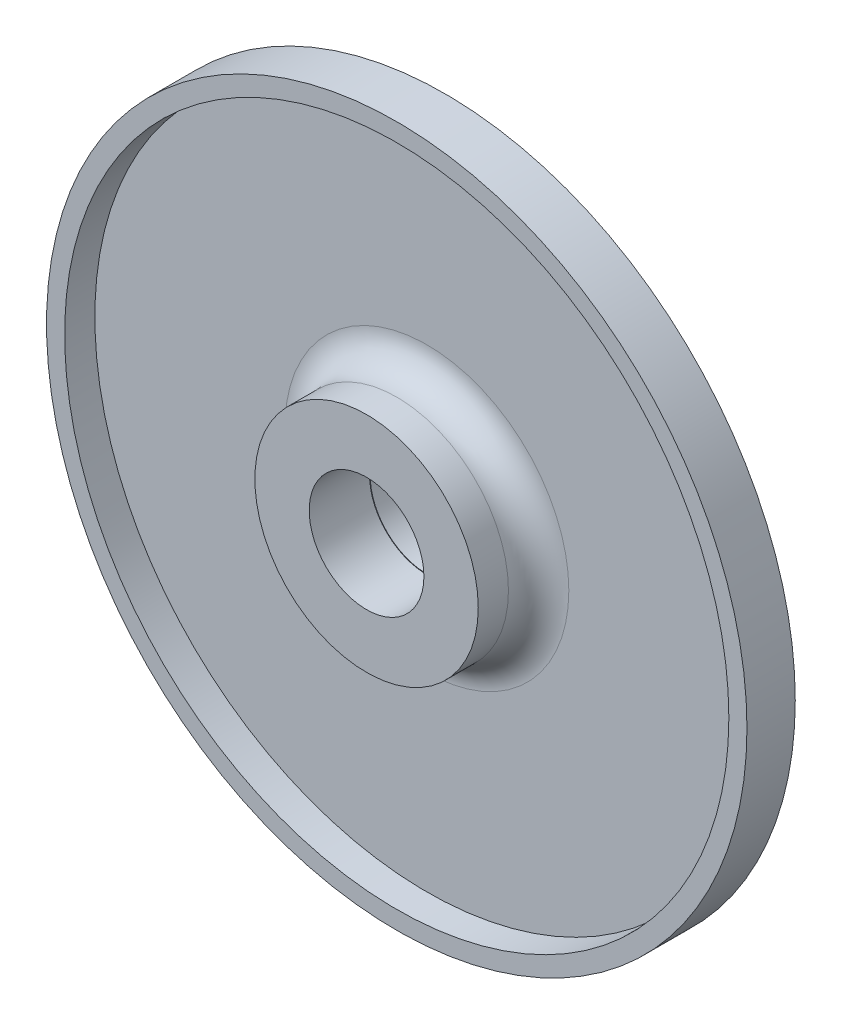
ISO-10303-21;
HEADER;
FILE_DESCRIPTION(('STEP AP214'),'2;1');
FILE_NAME('part.step','',(''),(''),'','','');
FILE_SCHEMA(('AUTOMOTIVE_DESIGN { 1 0 10303 214 1 1 1 1 }'));
ENDSEC;
DATA;
#1=APPLICATION_CONTEXT('core data for automotive mechanical design processes');
#2=APPLICATION_PROTOCOL_DEFINITION('international standard','automotive_design',2000,#1);
#3=PRODUCT_CONTEXT('',#1,'mechanical');
#4=PRODUCT('Part','Part','',(#3));
#5=PRODUCT_RELATED_PRODUCT_CATEGORY('part','',(#4));
#6=PRODUCT_DEFINITION_FORMATION('','',#4);
#7=PRODUCT_DEFINITION_CONTEXT('part definition',#1,'design');
#8=PRODUCT_DEFINITION('design','',#6,#7);
#9=PRODUCT_DEFINITION_SHAPE('','',#8);
#10=(LENGTH_UNIT() NAMED_UNIT(*) SI_UNIT(.MILLI.,.METRE.));
#11=(NAMED_UNIT(*) PLANE_ANGLE_UNIT() SI_UNIT($,.RADIAN.));
#12=(NAMED_UNIT(*) SI_UNIT($,.STERADIAN.) SOLID_ANGLE_UNIT());
#13=UNCERTAINTY_MEASURE_WITH_UNIT(LENGTH_MEASURE(1.E-05),#10,'distance_accuracy_value','');
#14=(GEOMETRIC_REPRESENTATION_CONTEXT(3) GLOBAL_UNCERTAINTY_ASSIGNED_CONTEXT((#13)) GLOBAL_UNIT_ASSIGNED_CONTEXT((#10,
#11,#12)) REPRESENTATION_CONTEXT('',''));
#15=CARTESIAN_POINT('',(0.,0.,0.));
#16=DIRECTION('',(0.,0.,1.));
#17=DIRECTION('',(1.,0.,0.));
#18=AXIS2_PLACEMENT_3D('',#15,#16,#17);
#19=CARTESIAN_POINT('',(0.,0.,0.));
#20=DIRECTION('',(0.,0.,1.));
#21=DIRECTION('',(1.,0.,0.));
#22=AXIS2_PLACEMENT_3D('',#19,#20,#21);
#23=PLANE('',#22);
#24=CARTESIAN_POINT('',(0.,0.,0.));
#25=DIRECTION('',(0.,0.,1.));
#26=DIRECTION('',(1.,0.,0.));
#27=AXIS2_PLACEMENT_3D('',#24,#25,#26);
#28=CIRCLE('',#27,58.);
#29=CARTESIAN_POINT('',(58.,0.,0.));
#30=VERTEX_POINT('',#29);
#31=EDGE_CURVE('E53',#30,#30,#28,.T.);
#32=ORIENTED_EDGE('',*,*,#31,.F.);
#33=EDGE_LOOP('',(#32));
#34=FACE_BOUND('',#33,.T.);
#35=CARTESIAN_POINT('',(0.,0.,0.));
#36=DIRECTION('',(0.,0.,1.));
#37=DIRECTION('',(1.,0.,0.));
#38=AXIS2_PLACEMENT_3D('',#35,#36,#37);
#39=CIRCLE('',#38,13.315);
#40=CARTESIAN_POINT('',(13.315,0.,0.));
#41=VERTEX_POINT('',#40);
#42=EDGE_CURVE('E10',#41,#41,#39,.F.);
#43=ORIENTED_EDGE('',*,*,#42,.F.);
#44=EDGE_LOOP('',(#43));
#45=FACE_BOUND('',#44,.T.);
#46=ADVANCED_FACE('F32',(#34,#45),#23,.F.);
#47=CARTESIAN_POINT('',(0.,0.,3.));
#48=DIRECTION('',(0.,0.,1.));
#49=DIRECTION('',(1.,0.,0.));
#50=AXIS2_PLACEMENT_3D('',#47,#48,#49);
#51=PLANE('',#50);
#52=CARTESIAN_POINT('',(0.,0.,3.));
#53=DIRECTION('',(0.,0.,1.));
#54=DIRECTION('',(1.,0.,0.));
#55=AXIS2_PLACEMENT_3D('',#52,#53,#54);
#56=CIRCLE('',#55,23.5);
#57=CARTESIAN_POINT('',(23.5,0.,3.));
#58=VERTEX_POINT('',#57);
#59=EDGE_CURVE('E40',#58,#58,#56,.F.);
#60=ORIENTED_EDGE('',*,*,#59,.T.);
#61=EDGE_LOOP('',(#60));
#62=FACE_BOUND('',#61,.T.);
#63=CARTESIAN_POINT('',(0.,0.,3.));
#64=DIRECTION('',(0.,0.,1.));
#65=DIRECTION('',(1.,0.,0.));
#66=AXIS2_PLACEMENT_3D('',#63,#64,#65);
#67=CIRCLE('',#66,55.);
#68=CARTESIAN_POINT('',(55.,0.,3.));
#69=VERTEX_POINT('',#68);
#70=EDGE_CURVE('E56',#69,#69,#67,.T.);
#71=ORIENTED_EDGE('',*,*,#70,.T.);
#72=EDGE_LOOP('',(#71));
#73=FACE_BOUND('',#72,.T.);
#74=ADVANCED_FACE('F87',(#62,#73),#51,.T.);
#75=CARTESIAN_POINT('',(0.,0.,8.));
#76=DIRECTION('',(0.,0.,-1.));
#77=DIRECTION('',(-1.,0.,0.));
#78=AXIS2_PLACEMENT_3D('',#75,#76,#77);
#79=CYLINDRICAL_SURFACE('',#78,58.);
#80=CARTESIAN_POINT('',(0.,0.,8.));
#81=DIRECTION('',(0.,0.,1.));
#82=DIRECTION('',(1.,0.,0.));
#83=AXIS2_PLACEMENT_3D('',#80,#81,#82);
#84=CIRCLE('',#83,58.);
#85=CARTESIAN_POINT('',(58.,0.,8.));
#86=VERTEX_POINT('',#85);
#87=EDGE_CURVE('E52',#86,#86,#84,.T.);
#88=ORIENTED_EDGE('',*,*,#87,.F.);
#89=EDGE_LOOP('',(#88));
#90=FACE_BOUND('',#89,.T.);
#91=ORIENTED_EDGE('',*,*,#31,.T.);
#92=EDGE_LOOP('',(#91));
#93=FACE_BOUND('',#92,.T.);
#94=ADVANCED_FACE('F108',(#90,#93),#79,.T.);
#95=CARTESIAN_POINT('',(0.,0.,8.));
#96=DIRECTION('',(0.,0.,1.));
#97=DIRECTION('',(1.,0.,0.));
#98=AXIS2_PLACEMENT_3D('',#95,#96,#97);
#99=PLANE('',#98);
#100=CARTESIAN_POINT('',(0.,0.,8.));
#101=DIRECTION('',(0.,0.,1.));
#102=DIRECTION('',(1.,0.,0.));
#103=AXIS2_PLACEMENT_3D('',#100,#101,#102);
#104=CIRCLE('',#103,55.);
#105=CARTESIAN_POINT('',(55.,0.,8.));
#106=VERTEX_POINT('',#105);
#107=EDGE_CURVE('E59',#106,#106,#104,.T.);
#108=ORIENTED_EDGE('',*,*,#107,.F.);
#109=EDGE_LOOP('',(#108));
#110=FACE_BOUND('',#109,.T.);
#111=ORIENTED_EDGE('',*,*,#87,.T.);
#112=EDGE_LOOP('',(#111));
#113=FACE_BOUND('',#112,.T.);
#114=ADVANCED_FACE('F113',(#110,#113),#99,.T.);
#115=CARTESIAN_POINT('',(0.,0.,3.));
#116=DIRECTION('',(0.,0.,1.));
#117=DIRECTION('',(1.,0.,0.));
#118=AXIS2_PLACEMENT_3D('',#115,#116,#117);
#119=CYLINDRICAL_SURFACE('',#118,55.);
#120=ORIENTED_EDGE('',*,*,#70,.F.);
#121=EDGE_LOOP('',(#120));
#122=FACE_BOUND('',#121,.T.);
#123=ORIENTED_EDGE('',*,*,#107,.T.);
#124=EDGE_LOOP('',(#123));
#125=FACE_BOUND('',#124,.T.);
#126=ADVANCED_FACE('F120',(#122,#125),#119,.F.);
#127=CARTESIAN_POINT('',(0.,0.,13.));
#128=DIRECTION('',(0.,0.,1.));
#129=DIRECTION('',(1.,0.,0.));
#130=AXIS2_PLACEMENT_3D('',#127,#128,#129);
#131=PLANE('',#130);
#132=CARTESIAN_POINT('',(0.,0.,13.));
#133=DIRECTION('',(0.,0.,1.));
#134=DIRECTION('',(1.,0.,0.));
#135=AXIS2_PLACEMENT_3D('',#132,#133,#134);
#136=CIRCLE('',#135,18.5);
#137=CARTESIAN_POINT('',(18.5,0.,13.));
#138=VERTEX_POINT('',#137);
#139=EDGE_CURVE('E62',#138,#138,#136,.T.);
#140=ORIENTED_EDGE('',*,*,#139,.T.);
#141=EDGE_LOOP('',(#140));
#142=FACE_BOUND('',#141,.T.);
#143=CARTESIAN_POINT('',(0.,0.,13.));
#144=DIRECTION('',(0.,0.,1.));
#145=DIRECTION('',(1.,0.,0.));
#146=AXIS2_PLACEMENT_3D('',#143,#144,#145);
#147=CIRCLE('',#146,9.5);
#148=CARTESIAN_POINT('',(9.5,0.,13.));
#149=VERTEX_POINT('',#148);
#150=EDGE_CURVE('E67',#149,#149,#147,.T.);
#151=ORIENTED_EDGE('',*,*,#150,.F.);
#152=EDGE_LOOP('',(#151));
#153=FACE_BOUND('',#152,.T.);
#154=ADVANCED_FACE('F97',(#142,#153),#131,.T.);
#155=CARTESIAN_POINT('',(0.,0.,13.));
#156=DIRECTION('',(0.,0.,-1.));
#157=DIRECTION('',(-1.,0.,0.));
#158=AXIS2_PLACEMENT_3D('',#155,#156,#157);
#159=CYLINDRICAL_SURFACE('',#158,18.5);
#160=CARTESIAN_POINT('',(0.,0.,8.));
#161=DIRECTION('',(0.,0.,1.));
#162=DIRECTION('',(1.,0.,0.));
#163=AXIS2_PLACEMENT_3D('',#160,#161,#162);
#164=CIRCLE('',#163,18.5);
#165=CARTESIAN_POINT('',(18.5,0.,8.));
#166=VERTEX_POINT('',#165);
#167=EDGE_CURVE('E44',#166,#166,#164,.T.);
#168=ORIENTED_EDGE('',*,*,#167,.T.);
#169=EDGE_LOOP('',(#168));
#170=FACE_BOUND('',#169,.T.);
#171=ORIENTED_EDGE('',*,*,#139,.F.);
#172=EDGE_LOOP('',(#171));
#173=FACE_BOUND('',#172,.T.);
#174=ADVANCED_FACE('F91',(#170,#173),#159,.T.);
#175=CARTESIAN_POINT('',(0.,0.,13.));
#176=DIRECTION('',(0.,0.,-1.));
#177=DIRECTION('',(-1.,0.,0.));
#178=AXIS2_PLACEMENT_3D('',#175,#176,#177);
#179=CYLINDRICAL_SURFACE('',#178,9.5);
#180=ORIENTED_EDGE('',*,*,#150,.T.);
#181=EDGE_LOOP('',(#180));
#182=FACE_BOUND('',#181,.T.);
#183=CARTESIAN_POINT('',(0.,0.,3.));
#184=DIRECTION('',(0.,0.,1.));
#185=DIRECTION('',(1.,0.,0.));
#186=AXIS2_PLACEMENT_3D('',#183,#184,#185);
#187=CIRCLE('',#186,9.5);
#188=CARTESIAN_POINT('',(9.5,0.,3.));
#189=VERTEX_POINT('',#188);
#190=EDGE_CURVE('E49',#189,#189,#187,.F.);
#191=ORIENTED_EDGE('',*,*,#190,.T.);
#192=EDGE_LOOP('',(#191));
#193=FACE_BOUND('',#192,.T.);
#194=ADVANCED_FACE('F85',(#182,#193),#179,.F.);
#195=CARTESIAN_POINT('',(0.,0.,3.));
#196=DIRECTION('',(0.,0.,1.));
#197=DIRECTION('',(1.,0.,0.));
#198=AXIS2_PLACEMENT_3D('',#195,#196,#197);
#199=CIRCLE('',#198,9.4);
#200=CARTESIAN_POINT('',(9.4,0.,3.));
#201=VERTEX_POINT('',#200);
#202=EDGE_CURVE('E36',#201,#201,#199,.T.);
#203=ORIENTED_EDGE('',*,*,#202,.F.);
#204=EDGE_LOOP('',(#203));
#205=FACE_BOUND('',#204,.T.);
#206=ORIENTED_EDGE('',*,*,#190,.F.);
#207=EDGE_LOOP('',(#206));
#208=FACE_BOUND('',#207,.T.);
#209=ADVANCED_FACE('F82',(#205,#208),#51,.T.);
#210=CARTESIAN_POINT('',(0.,0.,8.));
#211=DIRECTION('',(0.,0.,1.));
#212=DIRECTION('',(1.,0.,0.));
#213=AXIS2_PLACEMENT_3D('',#210,#211,#212);
#214=TOROIDAL_SURFACE('',#213,23.5,5.);
#215=ORIENTED_EDGE('',*,*,#59,.F.);
#216=EDGE_LOOP('',(#215));
#217=FACE_BOUND('',#216,.T.);
#218=ORIENTED_EDGE('',*,*,#167,.F.);
#219=EDGE_LOOP('',(#218));
#220=FACE_BOUND('',#219,.T.);
#221=ADVANCED_FACE('F34',(#217,#220),#214,.F.);
#222=CARTESIAN_POINT('',(0.,0.,-17.));
#223=DIRECTION('',(0.,0.,-1.));
#224=DIRECTION('',(-1.,0.,0.));
#225=AXIS2_PLACEMENT_3D('',#222,#223,#224);
#226=PLANE('',#225);
#227=CARTESIAN_POINT('',(0.,0.,-17.));
#228=DIRECTION('',(0.,0.,-1.));
#229=DIRECTION('',(-1.,0.,0.));
#230=AXIS2_PLACEMENT_3D('',#227,#228,#229);
#231=CIRCLE('',#230,13.315);
#232=CARTESIAN_POINT('',(-13.315,0.,-17.));
#233=VERTEX_POINT('',#232);
#234=EDGE_CURVE('E70',#233,#233,#231,.T.);
#235=ORIENTED_EDGE('',*,*,#234,.T.);
#236=EDGE_LOOP('',(#235));
#237=FACE_BOUND('',#236,.T.);
#238=CARTESIAN_POINT('',(0.,0.,-17.));
#239=DIRECTION('',(0.,0.,-1.));
#240=DIRECTION('',(-1.,0.,0.));
#241=AXIS2_PLACEMENT_3D('',#238,#239,#240);
#242=CIRCLE('',#241,9.4);
#243=CARTESIAN_POINT('',(-9.4,0.,-17.));
#244=VERTEX_POINT('',#243);
#245=EDGE_CURVE('E73',#244,#244,#242,.T.);
#246=ORIENTED_EDGE('',*,*,#245,.F.);
#247=EDGE_LOOP('',(#246));
#248=FACE_BOUND('',#247,.T.);
#249=ADVANCED_FACE('F159',(#237,#248),#226,.T.);
#250=CARTESIAN_POINT('',(0.,0.,-17.));
#251=DIRECTION('',(0.,0.,1.));
#252=DIRECTION('',(1.,0.,0.));
#253=AXIS2_PLACEMENT_3D('',#250,#251,#252);
#254=CYLINDRICAL_SURFACE('',#253,13.315);
#255=ORIENTED_EDGE('',*,*,#234,.F.);
#256=EDGE_LOOP('',(#255));
#257=FACE_BOUND('',#256,.T.);
#258=ORIENTED_EDGE('',*,*,#42,.T.);
#259=EDGE_LOOP('',(#258));
#260=FACE_BOUND('',#259,.T.);
#261=ADVANCED_FACE('F173',(#257,#260),#254,.T.);
#262=CARTESIAN_POINT('',(0.,0.,-17.));
#263=DIRECTION('',(0.,0.,1.));
#264=DIRECTION('',(1.,0.,0.));
#265=AXIS2_PLACEMENT_3D('',#262,#263,#264);
#266=CYLINDRICAL_SURFACE('',#265,9.4);
#267=ORIENTED_EDGE('',*,*,#245,.T.);
#268=EDGE_LOOP('',(#267));
#269=FACE_BOUND('',#268,.T.);
#270=ORIENTED_EDGE('',*,*,#202,.T.);
#271=EDGE_LOOP('',(#270));
#272=FACE_BOUND('',#271,.T.);
#273=ADVANCED_FACE('F80',(#269,#272),#266,.F.);
#274=CLOSED_SHELL('',(#46,#74,#94,#114,#126,#154,#174,#194,#209,#221,#249,#261,#273));
#275=MANIFOLD_SOLID_BREP('B2',#274);
#276=ADVANCED_BREP_SHAPE_REPRESENTATION('',(#18,#275),#14);
#277=SHAPE_DEFINITION_REPRESENTATION(#9,#276);
ENDSEC;
END-ISO-10303-21;
